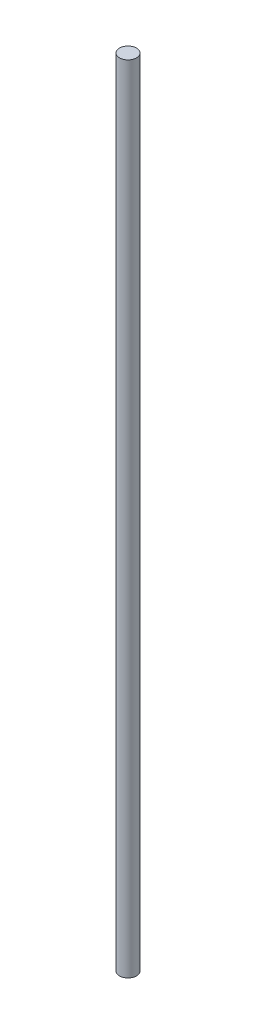
ISO-10303-21;
HEADER;
FILE_DESCRIPTION(('STEP AP214'),'2;1');
FILE_NAME('part.step','',(''),(''),'','','');
FILE_SCHEMA(('AUTOMOTIVE_DESIGN { 1 0 10303 214 1 1 1 1 }'));
ENDSEC;
DATA;
#1=APPLICATION_CONTEXT('core data for automotive mechanical design processes');
#2=APPLICATION_PROTOCOL_DEFINITION('international standard','automotive_design',2000,#1);
#3=PRODUCT_CONTEXT('',#1,'mechanical');
#4=PRODUCT('Part','Part','',(#3));
#5=PRODUCT_RELATED_PRODUCT_CATEGORY('part','',(#4));
#6=PRODUCT_DEFINITION_FORMATION('','',#4);
#7=PRODUCT_DEFINITION_CONTEXT('part definition',#1,'design');
#8=PRODUCT_DEFINITION('design','',#6,#7);
#9=PRODUCT_DEFINITION_SHAPE('','',#8);
#10=(LENGTH_UNIT() NAMED_UNIT(*) SI_UNIT(.MILLI.,.METRE.));
#11=(NAMED_UNIT(*) PLANE_ANGLE_UNIT() SI_UNIT($,.RADIAN.));
#12=(NAMED_UNIT(*) SI_UNIT($,.STERADIAN.) SOLID_ANGLE_UNIT());
#13=UNCERTAINTY_MEASURE_WITH_UNIT(LENGTH_MEASURE(1.E-05),#10,'distance_accuracy_value','');
#14=(GEOMETRIC_REPRESENTATION_CONTEXT(3) GLOBAL_UNCERTAINTY_ASSIGNED_CONTEXT((#13)) GLOBAL_UNIT_ASSIGNED_CONTEXT((#10,
#11,#12)) REPRESENTATION_CONTEXT('',''));
#15=CARTESIAN_POINT('',(0.,0.,0.));
#16=DIRECTION('',(0.,0.,1.));
#17=DIRECTION('',(1.,0.,0.));
#18=AXIS2_PLACEMENT_3D('',#15,#16,#17);
#19=CARTESIAN_POINT('',(0.,280.,0.));
#20=DIRECTION('',(0.,-1.,0.));
#21=DIRECTION('',(0.,0.,-1.));
#22=AXIS2_PLACEMENT_3D('',#19,#20,#21);
#23=CYLINDRICAL_SURFACE('',#22,3.);
#24=CARTESIAN_POINT('',(0.,280.,0.));
#25=DIRECTION('',(0.,1.,0.));
#26=DIRECTION('',(0.,0.,1.));
#27=AXIS2_PLACEMENT_3D('',#24,#25,#26);
#28=CIRCLE('',#27,3.);
#29=CARTESIAN_POINT('',(0.,280.,3.));
#30=VERTEX_POINT('',#29);
#31=EDGE_CURVE('E10',#30,#30,#28,.T.);
#32=ORIENTED_EDGE('',*,*,#31,.F.);
#33=EDGE_LOOP('',(#32));
#34=FACE_BOUND('',#33,.T.);
#35=CARTESIAN_POINT('',(0.,0.,0.));
#36=DIRECTION('',(0.,1.,0.));
#37=DIRECTION('',(0.,0.,1.));
#38=AXIS2_PLACEMENT_3D('',#35,#36,#37);
#39=CIRCLE('',#38,3.);
#40=CARTESIAN_POINT('',(0.,0.,3.));
#41=VERTEX_POINT('',#40);
#42=EDGE_CURVE('E35',#41,#41,#39,.T.);
#43=ORIENTED_EDGE('',*,*,#42,.T.);
#44=EDGE_LOOP('',(#43));
#45=FACE_BOUND('',#44,.T.);
#46=ADVANCED_FACE('F32',(#34,#45),#23,.T.);
#47=CARTESIAN_POINT('',(0.,280.,0.));
#48=DIRECTION('',(0.,1.,0.));
#49=DIRECTION('',(0.,0.,1.));
#50=AXIS2_PLACEMENT_3D('',#47,#48,#49);
#51=PLANE('',#50);
#52=ORIENTED_EDGE('',*,*,#31,.T.);
#53=EDGE_LOOP('',(#52));
#54=FACE_BOUND('',#53,.T.);
#55=ADVANCED_FACE('F47',(#54),#51,.T.);
#56=CARTESIAN_POINT('',(0.,0.,0.));
#57=DIRECTION('',(0.,1.,0.));
#58=DIRECTION('',(0.,0.,1.));
#59=AXIS2_PLACEMENT_3D('',#56,#57,#58);
#60=PLANE('',#59);
#61=ORIENTED_EDGE('',*,*,#42,.F.);
#62=EDGE_LOOP('',(#61));
#63=FACE_BOUND('',#62,.T.);
#64=ADVANCED_FACE('F45',(#63),#60,.F.);
#65=CLOSED_SHELL('',(#46,#55,#64));
#66=MANIFOLD_SOLID_BREP('B2',#65);
#67=ADVANCED_BREP_SHAPE_REPRESENTATION('',(#18,#66),#14);
#68=SHAPE_DEFINITION_REPRESENTATION(#9,#67);
ENDSEC;
END-ISO-10303-21;
